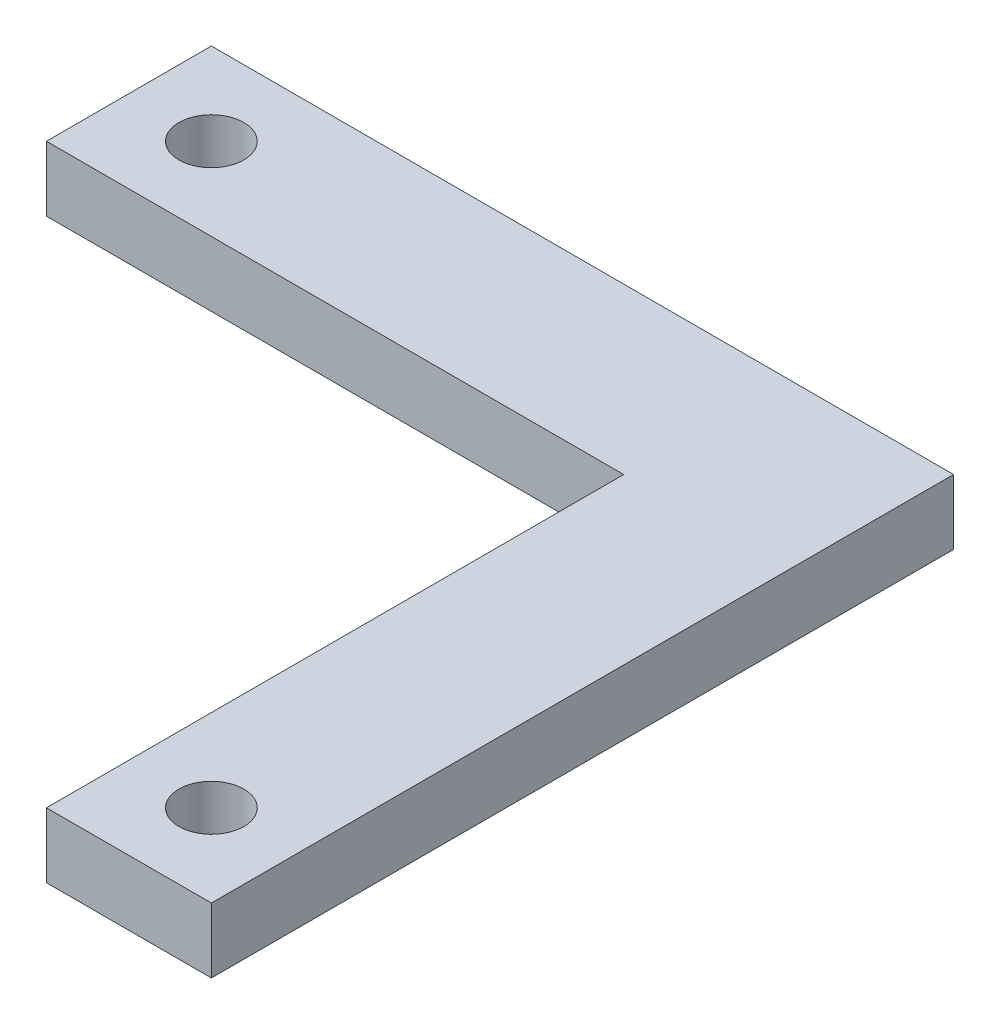
ISO-10303-21;
HEADER;
FILE_DESCRIPTION(('STEP AP214'),'2;1');
FILE_NAME('part.step','',(''),(''),'','','');
FILE_SCHEMA(('AUTOMOTIVE_DESIGN { 1 0 10303 214 1 1 1 1 }'));
ENDSEC;
DATA;
#1=APPLICATION_CONTEXT('core data for automotive mechanical design processes');
#2=APPLICATION_PROTOCOL_DEFINITION('international standard','automotive_design',2000,#1);
#3=PRODUCT_CONTEXT('',#1,'mechanical');
#4=PRODUCT('Part','Part','',(#3));
#5=PRODUCT_RELATED_PRODUCT_CATEGORY('part','',(#4));
#6=PRODUCT_DEFINITION_FORMATION('','',#4);
#7=PRODUCT_DEFINITION_CONTEXT('part definition',#1,'design');
#8=PRODUCT_DEFINITION('design','',#6,#7);
#9=PRODUCT_DEFINITION_SHAPE('','',#8);
#10=(LENGTH_UNIT() NAMED_UNIT(*) SI_UNIT(.MILLI.,.METRE.));
#11=(NAMED_UNIT(*) PLANE_ANGLE_UNIT() SI_UNIT($,.RADIAN.));
#12=(NAMED_UNIT(*) SI_UNIT($,.STERADIAN.) SOLID_ANGLE_UNIT());
#13=UNCERTAINTY_MEASURE_WITH_UNIT(LENGTH_MEASURE(1.E-05),#10,'distance_accuracy_value','');
#14=(GEOMETRIC_REPRESENTATION_CONTEXT(3) GLOBAL_UNCERTAINTY_ASSIGNED_CONTEXT((#13)) GLOBAL_UNIT_ASSIGNED_CONTEXT((#10,
#11,#12)) REPRESENTATION_CONTEXT('',''));
#15=CARTESIAN_POINT('',(0.,0.,0.));
#16=DIRECTION('',(0.,0.,1.));
#17=DIRECTION('',(1.,0.,0.));
#18=AXIS2_PLACEMENT_3D('',#15,#16,#17);
#19=CARTESIAN_POINT('',(44.45,5.,0.));
#20=DIRECTION('',(1.,0.,0.));
#21=DIRECTION('',(0.,0.,-1.));
#22=AXIS2_PLACEMENT_3D('',#19,#20,#21);
#23=PLANE('',#22);
#24=DIRECTION('',(0.,0.,1.));
#25=VECTOR('',#24,1.);
#26=CARTESIAN_POINT('',(44.45,0.,0.));
#27=LINE('',#26,#25);
#28=CARTESIAN_POINT('',(44.45,0.,0.));
#29=VERTEX_POINT('',#28);
#30=CARTESIAN_POINT('',(44.45,0.,44.45));
#31=VERTEX_POINT('',#30);
#32=EDGE_CURVE('E139',#29,#31,#27,.T.);
#33=ORIENTED_EDGE('',*,*,#32,.T.);
#34=DIRECTION('',(0.,-1.,0.));
#35=VECTOR('',#34,1.);
#36=CARTESIAN_POINT('',(44.45,5.,44.45));
#37=LINE('',#36,#35);
#38=CARTESIAN_POINT('',(44.45,5.,44.45));
#39=VERTEX_POINT('',#38);
#40=EDGE_CURVE('E11',#39,#31,#37,.T.);
#41=ORIENTED_EDGE('',*,*,#40,.F.);
#42=DIRECTION('',(0.,0.,1.));
#43=VECTOR('',#42,1.);
#44=CARTESIAN_POINT('',(44.45,5.,0.));
#45=LINE('',#44,#43);
#46=CARTESIAN_POINT('',(44.45,5.,0.));
#47=VERTEX_POINT('',#46);
#48=EDGE_CURVE('E269',#47,#39,#45,.T.);
#49=ORIENTED_EDGE('',*,*,#48,.F.);
#50=DIRECTION('',(0.,-1.,0.));
#51=VECTOR('',#50,1.);
#52=CARTESIAN_POINT('',(44.45,5.,0.));
#53=LINE('',#52,#51);
#54=EDGE_CURVE('E59',#47,#29,#53,.T.);
#55=ORIENTED_EDGE('',*,*,#54,.T.);
#56=EDGE_LOOP('',(#33,#41,#49,#55));
#57=FACE_BOUND('',#56,.T.);
#58=ADVANCED_FACE('F41',(#57),#23,.F.);
#59=CARTESIAN_POINT('',(0.,5.,44.45));
#60=DIRECTION('',(0.,0.,-1.));
#61=DIRECTION('',(-1.,0.,0.));
#62=AXIS2_PLACEMENT_3D('',#59,#60,#61);
#63=PLANE('',#62);
#64=DIRECTION('',(1.,0.,0.));
#65=VECTOR('',#64,1.);
#66=CARTESIAN_POINT('',(0.,0.,44.45));
#67=LINE('',#66,#65);
#68=CARTESIAN_POINT('',(57.15,0.,44.45));
#69=VERTEX_POINT('',#68);
#70=EDGE_CURVE('E142',#31,#69,#67,.T.);
#71=ORIENTED_EDGE('',*,*,#70,.T.);
#72=DIRECTION('',(0.,-1.,0.));
#73=VECTOR('',#72,1.);
#74=CARTESIAN_POINT('',(57.15,5.,44.45));
#75=LINE('',#74,#73);
#76=CARTESIAN_POINT('',(57.15,5.,44.45));
#77=VERTEX_POINT('',#76);
#78=EDGE_CURVE('E51',#77,#69,#75,.T.);
#79=ORIENTED_EDGE('',*,*,#78,.F.);
#80=DIRECTION('',(1.,0.,0.));
#81=VECTOR('',#80,1.);
#82=CARTESIAN_POINT('',(0.,5.,44.45));
#83=LINE('',#82,#81);
#84=EDGE_CURVE('E91',#39,#77,#83,.T.);
#85=ORIENTED_EDGE('',*,*,#84,.F.);
#86=ORIENTED_EDGE('',*,*,#40,.T.);
#87=EDGE_LOOP('',(#71,#79,#85,#86));
#88=FACE_BOUND('',#87,.T.);
#89=ADVANCED_FACE('F185',(#88),#63,.F.);
#90=CARTESIAN_POINT('',(57.15,5.,0.));
#91=DIRECTION('',(-1.,0.,0.));
#92=DIRECTION('',(0.,0.,1.));
#93=AXIS2_PLACEMENT_3D('',#90,#91,#92);
#94=PLANE('',#93);
#95=DIRECTION('',(0.,0.,-1.));
#96=VECTOR('',#95,1.);
#97=CARTESIAN_POINT('',(57.15,0.,0.));
#98=LINE('',#97,#96);
#99=CARTESIAN_POINT('',(57.15,0.,-12.7));
#100=VERTEX_POINT('',#99);
#101=EDGE_CURVE('E145',#69,#100,#98,.T.);
#102=ORIENTED_EDGE('',*,*,#101,.T.);
#103=DIRECTION('',(0.,-1.,0.));
#104=VECTOR('',#103,1.);
#105=CARTESIAN_POINT('',(57.15,5.,-12.7));
#106=LINE('',#105,#104);
#107=CARTESIAN_POINT('',(57.15,5.,-12.7));
#108=VERTEX_POINT('',#107);
#109=EDGE_CURVE('E111',#108,#100,#106,.T.);
#110=ORIENTED_EDGE('',*,*,#109,.F.);
#111=DIRECTION('',(0.,0.,-1.));
#112=VECTOR('',#111,1.);
#113=CARTESIAN_POINT('',(57.15,5.,0.));
#114=LINE('',#113,#112);
#115=EDGE_CURVE('E119',#77,#108,#114,.T.);
#116=ORIENTED_EDGE('',*,*,#115,.F.);
#117=ORIENTED_EDGE('',*,*,#78,.T.);
#118=EDGE_LOOP('',(#102,#110,#116,#117));
#119=FACE_BOUND('',#118,.T.);
#120=ADVANCED_FACE('F168',(#119),#94,.F.);
#121=CARTESIAN_POINT('',(0.,5.,-12.7));
#122=DIRECTION('',(0.,0.,-1.));
#123=DIRECTION('',(-1.,0.,0.));
#124=AXIS2_PLACEMENT_3D('',#121,#122,#123);
#125=PLANE('',#124);
#126=DIRECTION('',(1.,0.,0.));
#127=VECTOR('',#126,1.);
#128=CARTESIAN_POINT('',(0.,0.,-12.7));
#129=LINE('',#128,#127);
#130=CARTESIAN_POINT('',(0.,0.,-12.7));
#131=VERTEX_POINT('',#130);
#132=EDGE_CURVE('E106',#131,#100,#129,.T.);
#133=ORIENTED_EDGE('',*,*,#132,.F.);
#134=DIRECTION('',(0.,-1.,0.));
#135=VECTOR('',#134,1.);
#136=CARTESIAN_POINT('',(0.,5.,-12.7));
#137=LINE('',#136,#135);
#138=CARTESIAN_POINT('',(0.,5.,-12.7));
#139=VERTEX_POINT('',#138);
#140=EDGE_CURVE('E101',#139,#131,#137,.T.);
#141=ORIENTED_EDGE('',*,*,#140,.F.);
#142=DIRECTION('',(1.,0.,0.));
#143=VECTOR('',#142,1.);
#144=CARTESIAN_POINT('',(0.,5.,-12.7));
#145=LINE('',#144,#143);
#146=EDGE_CURVE('E104',#139,#108,#145,.T.);
#147=ORIENTED_EDGE('',*,*,#146,.T.);
#148=ORIENTED_EDGE('',*,*,#109,.T.);
#149=EDGE_LOOP('',(#133,#141,#147,#148));
#150=FACE_BOUND('',#149,.T.);
#151=ADVANCED_FACE('F103',(#150),#125,.T.);
#152=CARTESIAN_POINT('',(0.,5.,0.));
#153=DIRECTION('',(-1.,0.,0.));
#154=DIRECTION('',(0.,0.,1.));
#155=AXIS2_PLACEMENT_3D('',#152,#153,#154);
#156=PLANE('',#155);
#157=DIRECTION('',(0.,0.,-1.));
#158=VECTOR('',#157,1.);
#159=CARTESIAN_POINT('',(0.,0.,0.));
#160=LINE('',#159,#158);
#161=CARTESIAN_POINT('',(0.,0.,0.));
#162=VERTEX_POINT('',#161);
#163=EDGE_CURVE('E151',#162,#131,#160,.T.);
#164=ORIENTED_EDGE('',*,*,#163,.F.);
#165=DIRECTION('',(0.,-1.,0.));
#166=VECTOR('',#165,1.);
#167=CARTESIAN_POINT('',(0.,5.,0.));
#168=LINE('',#167,#166);
#169=CARTESIAN_POINT('',(0.,5.,0.));
#170=VERTEX_POINT('',#169);
#171=EDGE_CURVE('E79',#170,#162,#168,.T.);
#172=ORIENTED_EDGE('',*,*,#171,.F.);
#173=DIRECTION('',(0.,0.,-1.));
#174=VECTOR('',#173,1.);
#175=CARTESIAN_POINT('',(0.,5.,0.));
#176=LINE('',#175,#174);
#177=EDGE_CURVE('E117',#170,#139,#176,.T.);
#178=ORIENTED_EDGE('',*,*,#177,.T.);
#179=ORIENTED_EDGE('',*,*,#140,.T.);
#180=EDGE_LOOP('',(#164,#172,#178,#179));
#181=FACE_BOUND('',#180,.T.);
#182=ADVANCED_FACE('F123',(#181),#156,.T.);
#183=CARTESIAN_POINT('',(6.35,5.,-6.35));
#184=DIRECTION('',(0.,-1.,0.));
#185=DIRECTION('',(0.,0.,-1.));
#186=AXIS2_PLACEMENT_3D('',#183,#184,#185);
#187=CYLINDRICAL_SURFACE('',#186,2.5);
#188=CARTESIAN_POINT('',(6.35,5.,-6.35));
#189=DIRECTION('',(0.,1.,0.));
#190=DIRECTION('',(0.,0.,1.));
#191=AXIS2_PLACEMENT_3D('',#188,#189,#190);
#192=CIRCLE('',#191,2.5);
#193=CARTESIAN_POINT('',(6.35,5.,-3.85));
#194=VERTEX_POINT('',#193);
#195=EDGE_CURVE('E200',#194,#194,#192,.T.);
#196=ORIENTED_EDGE('',*,*,#195,.T.);
#197=EDGE_LOOP('',(#196));
#198=FACE_BOUND('',#197,.T.);
#199=CARTESIAN_POINT('',(6.35,0.,-6.35));
#200=DIRECTION('',(0.,1.,0.));
#201=DIRECTION('',(0.,0.,1.));
#202=AXIS2_PLACEMENT_3D('',#199,#200,#201);
#203=CIRCLE('',#202,2.5);
#204=CARTESIAN_POINT('',(6.35,0.,-3.85));
#205=VERTEX_POINT('',#204);
#206=EDGE_CURVE('E135',#205,#205,#203,.T.);
#207=ORIENTED_EDGE('',*,*,#206,.F.);
#208=EDGE_LOOP('',(#207));
#209=FACE_BOUND('',#208,.T.);
#210=ADVANCED_FACE('F180',(#198,#209),#187,.F.);
#211=CARTESIAN_POINT('',(50.8,5.,38.1));
#212=DIRECTION('',(0.,-1.,0.));
#213=DIRECTION('',(0.,0.,-1.));
#214=AXIS2_PLACEMENT_3D('',#211,#212,#213);
#215=CYLINDRICAL_SURFACE('',#214,2.5);
#216=CARTESIAN_POINT('',(50.8,5.,38.1));
#217=DIRECTION('',(0.,1.,0.));
#218=DIRECTION('',(0.,0.,1.));
#219=AXIS2_PLACEMENT_3D('',#216,#217,#218);
#220=CIRCLE('',#219,2.5);
#221=CARTESIAN_POINT('',(50.8,5.,40.6));
#222=VERTEX_POINT('',#221);
#223=EDGE_CURVE('E158',#222,#222,#220,.T.);
#224=ORIENTED_EDGE('',*,*,#223,.T.);
#225=EDGE_LOOP('',(#224));
#226=FACE_BOUND('',#225,.T.);
#227=CARTESIAN_POINT('',(50.8,0.,38.1));
#228=DIRECTION('',(0.,1.,0.));
#229=DIRECTION('',(0.,0.,1.));
#230=AXIS2_PLACEMENT_3D('',#227,#228,#229);
#231=CIRCLE('',#230,2.5);
#232=CARTESIAN_POINT('',(50.8,0.,40.6));
#233=VERTEX_POINT('',#232);
#234=EDGE_CURVE('E131',#233,#233,#231,.T.);
#235=ORIENTED_EDGE('',*,*,#234,.F.);
#236=EDGE_LOOP('',(#235));
#237=FACE_BOUND('',#236,.T.);
#238=ADVANCED_FACE('F43',(#226,#237),#215,.F.);
#239=CARTESIAN_POINT('',(0.,5.,0.));
#240=DIRECTION('',(0.,0.,1.));
#241=DIRECTION('',(1.,0.,0.));
#242=AXIS2_PLACEMENT_3D('',#239,#240,#241);
#243=PLANE('',#242);
#244=DIRECTION('',(-1.,0.,0.));
#245=VECTOR('',#244,1.);
#246=CARTESIAN_POINT('',(0.,0.,0.));
#247=LINE('',#246,#245);
#248=EDGE_CURVE('E154',#29,#162,#247,.T.);
#249=ORIENTED_EDGE('',*,*,#248,.F.);
#250=ORIENTED_EDGE('',*,*,#54,.F.);
#251=DIRECTION('',(-1.,0.,0.));
#252=VECTOR('',#251,1.);
#253=CARTESIAN_POINT('',(0.,5.,0.));
#254=LINE('',#253,#252);
#255=EDGE_CURVE('E125',#47,#170,#254,.T.);
#256=ORIENTED_EDGE('',*,*,#255,.T.);
#257=ORIENTED_EDGE('',*,*,#171,.T.);
#258=EDGE_LOOP('',(#249,#250,#256,#257));
#259=FACE_BOUND('',#258,.T.);
#260=ADVANCED_FACE('F171',(#259),#243,.T.);
#261=CARTESIAN_POINT('',(0.,5.,0.));
#262=DIRECTION('',(0.,1.,0.));
#263=DIRECTION('',(0.,0.,1.));
#264=AXIS2_PLACEMENT_3D('',#261,#262,#263);
#265=PLANE('',#264);
#266=ORIENTED_EDGE('',*,*,#223,.F.);
#267=EDGE_LOOP('',(#266));
#268=FACE_BOUND('',#267,.T.);
#269=ORIENTED_EDGE('',*,*,#195,.F.);
#270=EDGE_LOOP('',(#269));
#271=FACE_BOUND('',#270,.T.);
#272=ORIENTED_EDGE('',*,*,#48,.T.);
#273=ORIENTED_EDGE('',*,*,#84,.T.);
#274=ORIENTED_EDGE('',*,*,#115,.T.);
#275=ORIENTED_EDGE('',*,*,#146,.F.);
#276=ORIENTED_EDGE('',*,*,#177,.F.);
#277=ORIENTED_EDGE('',*,*,#255,.F.);
#278=EDGE_LOOP('',(#272,#273,#274,#275,#276,#277));
#279=FACE_BOUND('',#278,.T.);
#280=ADVANCED_FACE('F115',(#268,#271,#279),#265,.T.);
#281=CARTESIAN_POINT('',(0.,0.,0.));
#282=DIRECTION('',(0.,1.,0.));
#283=DIRECTION('',(0.,0.,1.));
#284=AXIS2_PLACEMENT_3D('',#281,#282,#283);
#285=PLANE('',#284);
#286=ORIENTED_EDGE('',*,*,#234,.T.);
#287=EDGE_LOOP('',(#286));
#288=FACE_BOUND('',#287,.T.);
#289=ORIENTED_EDGE('',*,*,#206,.T.);
#290=EDGE_LOOP('',(#289));
#291=FACE_BOUND('',#290,.T.);
#292=ORIENTED_EDGE('',*,*,#32,.F.);
#293=ORIENTED_EDGE('',*,*,#248,.T.);
#294=ORIENTED_EDGE('',*,*,#163,.T.);
#295=ORIENTED_EDGE('',*,*,#132,.T.);
#296=ORIENTED_EDGE('',*,*,#101,.F.);
#297=ORIENTED_EDGE('',*,*,#70,.F.);
#298=EDGE_LOOP('',(#292,#293,#294,#295,#296,#297));
#299=FACE_BOUND('',#298,.T.);
#300=ADVANCED_FACE('F170',(#288,#291,#299),#285,.F.);
#301=CLOSED_SHELL('',(#58,#89,#120,#151,#182,#210,#238,#260,#280,#300));
#302=MANIFOLD_SOLID_BREP('B2',#301);
#303=ADVANCED_BREP_SHAPE_REPRESENTATION('',(#18,#302),#14);
#304=SHAPE_DEFINITION_REPRESENTATION(#9,#303);
ENDSEC;
END-ISO-10303-21;
